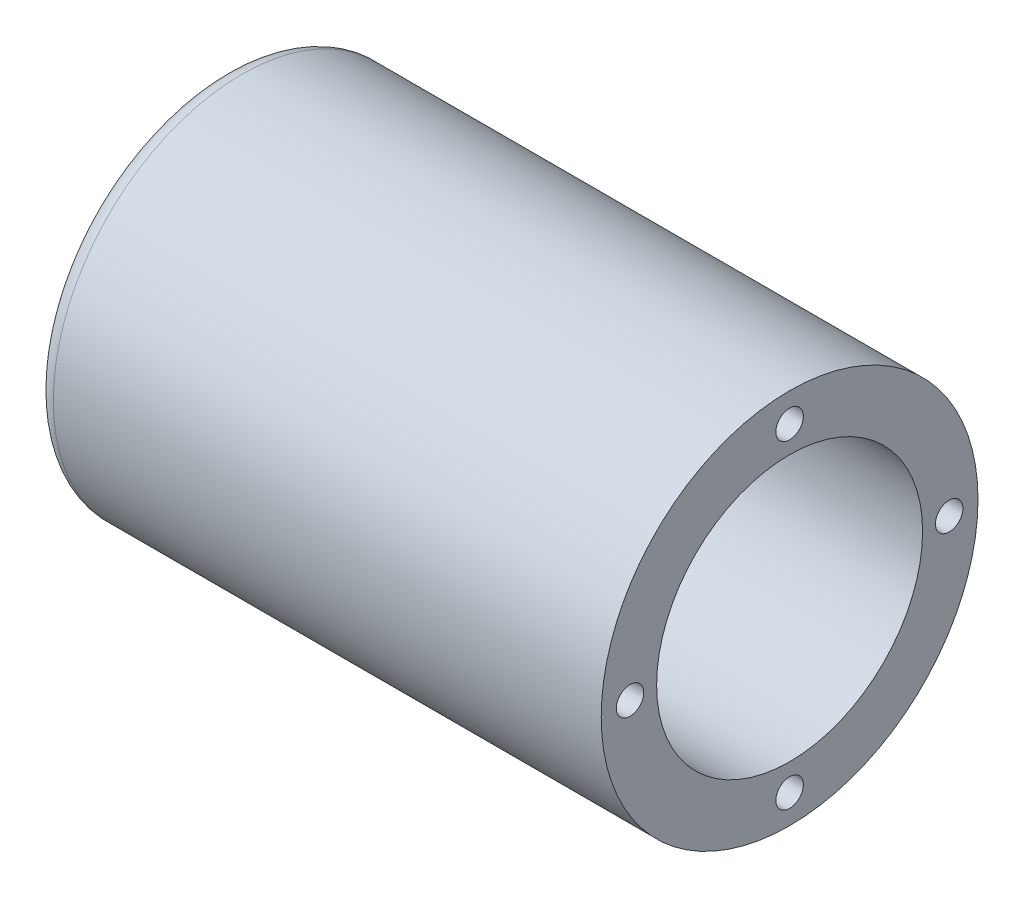
ISO-10303-21;
HEADER;
FILE_DESCRIPTION(('STEP AP214'),'2;1');
FILE_NAME('part.step','',(''),(''),'','','');
FILE_SCHEMA(('AUTOMOTIVE_DESIGN { 1 0 10303 214 1 1 1 1 }'));
ENDSEC;
DATA;
#1=APPLICATION_CONTEXT('core data for automotive mechanical design processes');
#2=APPLICATION_PROTOCOL_DEFINITION('international standard','automotive_design',2000,#1);
#3=PRODUCT_CONTEXT('',#1,'mechanical');
#4=PRODUCT('Part','Part','',(#3));
#5=PRODUCT_RELATED_PRODUCT_CATEGORY('part','',(#4));
#6=PRODUCT_DEFINITION_FORMATION('','',#4);
#7=PRODUCT_DEFINITION_CONTEXT('part definition',#1,'design');
#8=PRODUCT_DEFINITION('design','',#6,#7);
#9=PRODUCT_DEFINITION_SHAPE('','',#8);
#10=(LENGTH_UNIT() NAMED_UNIT(*) SI_UNIT(.MILLI.,.METRE.));
#11=(NAMED_UNIT(*) PLANE_ANGLE_UNIT() SI_UNIT($,.RADIAN.));
#12=(NAMED_UNIT(*) SI_UNIT($,.STERADIAN.) SOLID_ANGLE_UNIT());
#13=UNCERTAINTY_MEASURE_WITH_UNIT(LENGTH_MEASURE(1.E-05),#10,'distance_accuracy_value','');
#14=(GEOMETRIC_REPRESENTATION_CONTEXT(3) GLOBAL_UNCERTAINTY_ASSIGNED_CONTEXT((#13)) GLOBAL_UNIT_ASSIGNED_CONTEXT((#10,
#11,#12)) REPRESENTATION_CONTEXT('',''));
#15=CARTESIAN_POINT('',(0.,0.,0.));
#16=DIRECTION('',(0.,0.,1.));
#17=DIRECTION('',(1.,0.,0.));
#18=AXIS2_PLACEMENT_3D('',#15,#16,#17);
#19=CARTESIAN_POINT('',(-31.9,0.,0.));
#20=DIRECTION('',(1.,0.,0.));
#21=DIRECTION('',(0.,1.,0.));
#22=AXIS2_PLACEMENT_3D('',#19,#20,#21);
#23=PLANE('',#22);
#24=CARTESIAN_POINT('',(-31.9,0.,0.));
#25=DIRECTION('',(1.,0.,0.));
#26=DIRECTION('',(0.,1.,0.));
#27=AXIS2_PLACEMENT_3D('',#24,#25,#26);
#28=CIRCLE('',#27,19.25);
#29=CARTESIAN_POINT('',(-31.9,19.25,0.));
#30=VERTEX_POINT('',#29);
#31=EDGE_CURVE('E44',#30,#30,#28,.F.);
#32=ORIENTED_EDGE('',*,*,#31,.T.);
#33=EDGE_LOOP('',(#32));
#34=FACE_BOUND('',#33,.T.);
#35=CARTESIAN_POINT('',(-31.9,0.,12.));
#36=DIRECTION('',(1.,0.,0.));
#37=DIRECTION('',(0.,1.,0.));
#38=AXIS2_PLACEMENT_3D('',#35,#36,#37);
#39=CIRCLE('',#38,1.8);
#40=CARTESIAN_POINT('',(-31.9,1.79999999999995,12.));
#41=VERTEX_POINT('',#40);
#42=EDGE_CURVE('E90',#41,#41,#39,.F.);
#43=ORIENTED_EDGE('',*,*,#42,.F.);
#44=EDGE_LOOP('',(#43));
#45=FACE_BOUND('',#44,.T.);
#46=CARTESIAN_POINT('',(-31.9,-12.,0.));
#47=DIRECTION('',(1.,0.,0.));
#48=DIRECTION('',(0.,1.,0.));
#49=AXIS2_PLACEMENT_3D('',#46,#47,#48);
#50=CIRCLE('',#49,1.8);
#51=CARTESIAN_POINT('',(-31.9,-10.2,0.));
#52=VERTEX_POINT('',#51);
#53=EDGE_CURVE('E98',#52,#52,#50,.F.);
#54=ORIENTED_EDGE('',*,*,#53,.F.);
#55=EDGE_LOOP('',(#54));
#56=FACE_BOUND('',#55,.T.);
#57=CARTESIAN_POINT('',(-31.9,1.19833393264433E-13,-12.));
#58=DIRECTION('',(1.,0.,0.));
#59=DIRECTION('',(0.,1.,0.));
#60=AXIS2_PLACEMENT_3D('',#57,#58,#59);
#61=CIRCLE('',#60,1.8);
#62=CARTESIAN_POINT('',(-31.9,1.80000000000012,-12.));
#63=VERTEX_POINT('',#62);
#64=EDGE_CURVE('E91',#63,#63,#61,.F.);
#65=ORIENTED_EDGE('',*,*,#64,.F.);
#66=EDGE_LOOP('',(#65));
#67=FACE_BOUND('',#66,.T.);
#68=CARTESIAN_POINT('',(-31.9,12.,0.));
#69=DIRECTION('',(1.,0.,0.));
#70=DIRECTION('',(0.,1.,0.));
#71=AXIS2_PLACEMENT_3D('',#68,#69,#70);
#72=CIRCLE('',#71,1.8);
#73=CARTESIAN_POINT('',(-31.9,13.8,0.));
#74=VERTEX_POINT('',#73);
#75=EDGE_CURVE('E71',#74,#74,#72,.F.);
#76=ORIENTED_EDGE('',*,*,#75,.F.);
#77=EDGE_LOOP('',(#76));
#78=FACE_BOUND('',#77,.T.);
#79=ADVANCED_FACE('F37',(#34,#45,#56,#67,#78),#23,.F.);
#80=CARTESIAN_POINT('',(-31.9,0.,0.));
#81=DIRECTION('',(-1.,0.,0.));
#82=DIRECTION('',(0.,-1.,0.));
#83=AXIS2_PLACEMENT_3D('',#80,#81,#82);
#84=CYLINDRICAL_SURFACE('',#83,21.25);
#85=CARTESIAN_POINT('',(-29.9,0.,0.));
#86=DIRECTION('',(1.,0.,0.));
#87=DIRECTION('',(0.,1.,0.));
#88=AXIS2_PLACEMENT_3D('',#85,#86,#87);
#89=CIRCLE('',#88,21.25);
#90=CARTESIAN_POINT('',(-29.9,21.25,0.));
#91=VERTEX_POINT('',#90);
#92=EDGE_CURVE('E10',#91,#91,#89,.T.);
#93=ORIENTED_EDGE('',*,*,#92,.T.);
#94=EDGE_LOOP('',(#93));
#95=FACE_BOUND('',#94,.T.);
#96=CARTESIAN_POINT('',(31.9,0.,0.));
#97=DIRECTION('',(-1.,0.,0.));
#98=DIRECTION('',(0.,-1.,0.));
#99=AXIS2_PLACEMENT_3D('',#96,#97,#98);
#100=CIRCLE('',#99,21.25);
#101=CARTESIAN_POINT('',(31.9,-21.25,0.));
#102=VERTEX_POINT('',#101);
#103=EDGE_CURVE('E48',#102,#102,#100,.T.);
#104=ORIENTED_EDGE('',*,*,#103,.T.);
#105=EDGE_LOOP('',(#104));
#106=FACE_BOUND('',#105,.T.);
#107=ADVANCED_FACE('F134',(#95,#106),#84,.T.);
#108=CARTESIAN_POINT('',(31.9,21.25,0.));
#109=DIRECTION('',(-1.,0.,0.));
#110=DIRECTION('',(0.,-1.,0.));
#111=AXIS2_PLACEMENT_3D('',#108,#109,#110);
#112=PLANE('',#111);
#113=CARTESIAN_POINT('',(31.9,0.,-18.));
#114=DIRECTION('',(1.,0.,0.));
#115=DIRECTION('',(0.,0.,-1.));
#116=AXIS2_PLACEMENT_3D('',#113,#114,#115);
#117=CIRCLE('',#116,1.55);
#118=CARTESIAN_POINT('',(31.9,1.54999999999994,-18.));
#119=VERTEX_POINT('',#118);
#120=EDGE_CURVE('E80',#119,#119,#117,.T.);
#121=ORIENTED_EDGE('',*,*,#120,.F.);
#122=EDGE_LOOP('',(#121));
#123=FACE_BOUND('',#122,.T.);
#124=CARTESIAN_POINT('',(31.9,-18.,0.));
#125=DIRECTION('',(1.,0.,0.));
#126=DIRECTION('',(0.,-1.,0.));
#127=AXIS2_PLACEMENT_3D('',#124,#125,#126);
#128=CIRCLE('',#127,1.55);
#129=CARTESIAN_POINT('',(31.9,-16.45,0.));
#130=VERTEX_POINT('',#129);
#131=EDGE_CURVE('E74',#130,#130,#128,.T.);
#132=ORIENTED_EDGE('',*,*,#131,.F.);
#133=EDGE_LOOP('',(#132));
#134=FACE_BOUND('',#133,.T.);
#135=CARTESIAN_POINT('',(31.9,1.94399927231449E-13,18.));
#136=DIRECTION('',(1.,0.,0.));
#137=DIRECTION('',(0.,0.,1.));
#138=AXIS2_PLACEMENT_3D('',#135,#136,#137);
#139=CIRCLE('',#138,1.55);
#140=CARTESIAN_POINT('',(31.9,1.55000000000019,18.));
#141=VERTEX_POINT('',#140);
#142=EDGE_CURVE('E67',#141,#141,#139,.T.);
#143=ORIENTED_EDGE('',*,*,#142,.F.);
#144=EDGE_LOOP('',(#143));
#145=FACE_BOUND('',#144,.T.);
#146=CARTESIAN_POINT('',(31.9,18.,0.));
#147=DIRECTION('',(1.,0.,0.));
#148=DIRECTION('',(0.,1.,0.));
#149=AXIS2_PLACEMENT_3D('',#146,#147,#148);
#150=CIRCLE('',#149,1.55);
#151=CARTESIAN_POINT('',(31.9,19.55,0.));
#152=VERTEX_POINT('',#151);
#153=EDGE_CURVE('E61',#152,#152,#150,.T.);
#154=ORIENTED_EDGE('',*,*,#153,.F.);
#155=EDGE_LOOP('',(#154));
#156=FACE_BOUND('',#155,.T.);
#157=CARTESIAN_POINT('',(31.9,0.,0.));
#158=DIRECTION('',(1.,0.,0.));
#159=DIRECTION('',(0.,1.,0.));
#160=AXIS2_PLACEMENT_3D('',#157,#158,#159);
#161=CIRCLE('',#160,15.);
#162=CARTESIAN_POINT('',(31.9,15.,0.));
#163=VERTEX_POINT('',#162);
#164=EDGE_CURVE('E55',#163,#163,#161,.T.);
#165=ORIENTED_EDGE('',*,*,#164,.F.);
#166=EDGE_LOOP('',(#165));
#167=FACE_BOUND('',#166,.T.);
#168=ORIENTED_EDGE('',*,*,#103,.F.);
#169=EDGE_LOOP('',(#168));
#170=FACE_BOUND('',#169,.T.);
#171=ADVANCED_FACE('F128',(#123,#134,#145,#156,#167,#170),#112,.F.);
#172=CARTESIAN_POINT('',(-29.4,0.,0.));
#173=DIRECTION('',(1.,0.,0.));
#174=DIRECTION('',(0.,1.,0.));
#175=AXIS2_PLACEMENT_3D('',#172,#173,#174);
#176=CYLINDRICAL_SURFACE('',#175,15.);
#177=CARTESIAN_POINT('',(-29.4,0.,0.));
#178=DIRECTION('',(1.,0.,0.));
#179=DIRECTION('',(0.,1.,0.));
#180=AXIS2_PLACEMENT_3D('',#177,#178,#179);
#181=CIRCLE('',#180,15.);
#182=CARTESIAN_POINT('',(-29.4,15.,0.));
#183=VERTEX_POINT('',#182);
#184=EDGE_CURVE('E52',#183,#183,#181,.T.);
#185=ORIENTED_EDGE('',*,*,#184,.F.);
#186=EDGE_LOOP('',(#185));
#187=FACE_BOUND('',#186,.T.);
#188=ORIENTED_EDGE('',*,*,#164,.T.);
#189=EDGE_LOOP('',(#188));
#190=FACE_BOUND('',#189,.T.);
#191=ADVANCED_FACE('F116',(#187,#190),#176,.F.);
#192=CARTESIAN_POINT('',(-29.4,0.,0.));
#193=DIRECTION('',(1.,0.,0.));
#194=DIRECTION('',(0.,1.,0.));
#195=AXIS2_PLACEMENT_3D('',#192,#193,#194);
#196=PLANE('',#195);
#197=CARTESIAN_POINT('',(-29.4,0.,12.));
#198=DIRECTION('',(1.,0.,0.));
#199=DIRECTION('',(0.,0.,1.));
#200=AXIS2_PLACEMENT_3D('',#197,#198,#199);
#201=CIRCLE('',#200,1.8);
#202=CARTESIAN_POINT('',(-29.4,0.,13.8));
#203=VERTEX_POINT('',#202);
#204=EDGE_CURVE('E101',#203,#203,#201,.T.);
#205=ORIENTED_EDGE('',*,*,#204,.F.);
#206=EDGE_LOOP('',(#205));
#207=FACE_BOUND('',#206,.T.);
#208=CARTESIAN_POINT('',(-29.4,-12.,0.));
#209=DIRECTION('',(1.,0.,0.));
#210=DIRECTION('',(0.,-1.,0.));
#211=AXIS2_PLACEMENT_3D('',#208,#209,#210);
#212=CIRCLE('',#211,1.8);
#213=CARTESIAN_POINT('',(-29.4,-13.8,0.));
#214=VERTEX_POINT('',#213);
#215=EDGE_CURVE('E94',#214,#214,#212,.T.);
#216=ORIENTED_EDGE('',*,*,#215,.F.);
#217=EDGE_LOOP('',(#216));
#218=FACE_BOUND('',#217,.T.);
#219=CARTESIAN_POINT('',(-29.4,1.20292635814113E-13,-12.));
#220=DIRECTION('',(1.,0.,0.));
#221=DIRECTION('',(0.,0.,-1.));
#222=AXIS2_PLACEMENT_3D('',#219,#220,#221);
#223=CIRCLE('',#222,1.8);
#224=CARTESIAN_POINT('',(-29.4,1.39146635043866E-13,-13.8));
#225=VERTEX_POINT('',#224);
#226=EDGE_CURVE('E95',#225,#225,#223,.T.);
#227=ORIENTED_EDGE('',*,*,#226,.F.);
#228=EDGE_LOOP('',(#227));
#229=FACE_BOUND('',#228,.T.);
#230=CARTESIAN_POINT('',(-29.4,12.,0.));
#231=DIRECTION('',(1.,0.,0.));
#232=DIRECTION('',(0.,1.,0.));
#233=AXIS2_PLACEMENT_3D('',#230,#231,#232);
#234=CIRCLE('',#233,1.8);
#235=CARTESIAN_POINT('',(-29.4,13.8,0.));
#236=VERTEX_POINT('',#235);
#237=EDGE_CURVE('E87',#236,#236,#234,.T.);
#238=ORIENTED_EDGE('',*,*,#237,.F.);
#239=EDGE_LOOP('',(#238));
#240=FACE_BOUND('',#239,.T.);
#241=ORIENTED_EDGE('',*,*,#184,.T.);
#242=EDGE_LOOP('',(#241));
#243=FACE_BOUND('',#242,.T.);
#244=ADVANCED_FACE('F112',(#207,#218,#229,#240,#243),#196,.T.);
#245=CARTESIAN_POINT('',(28.1,18.,0.));
#246=DIRECTION('',(1.,0.,0.));
#247=DIRECTION('',(0.,1.,0.));
#248=AXIS2_PLACEMENT_3D('',#245,#246,#247);
#249=CYLINDRICAL_SURFACE('',#248,1.55);
#250=CARTESIAN_POINT('',(28.1,18.,0.));
#251=DIRECTION('',(1.,0.,0.));
#252=DIRECTION('',(0.,1.,0.));
#253=AXIS2_PLACEMENT_3D('',#250,#251,#252);
#254=CIRCLE('',#253,1.55);
#255=CARTESIAN_POINT('',(28.1,19.55,0.));
#256=VERTEX_POINT('',#255);
#257=EDGE_CURVE('E58',#256,#256,#254,.T.);
#258=CARTESIAN_POINT('',(28.1,19.55,0.));
#259=CARTESIAN_POINT('',(28.1395833333333,19.55,0.));
#260=CARTESIAN_POINT('',(28.1791666666667,19.55,0.));
#261=CARTESIAN_POINT('',(28.2583333333333,19.55,0.));
#262=CARTESIAN_POINT('',(28.2979166666667,19.55,0.));
#263=CARTESIAN_POINT('',(28.3770833333333,19.55,0.));
#264=CARTESIAN_POINT('',(28.4166666666667,19.55,0.));
#265=CARTESIAN_POINT('',(28.4958333333333,19.55,0.));
#266=CARTESIAN_POINT('',(28.5354166666667,19.55,0.));
#267=CARTESIAN_POINT('',(28.6145833333333,19.55,0.));
#268=CARTESIAN_POINT('',(28.6541666666667,19.55,0.));
#269=CARTESIAN_POINT('',(28.7333333333333,19.55,0.));
#270=CARTESIAN_POINT('',(28.7729166666667,19.55,0.));
#271=CARTESIAN_POINT('',(28.8520833333333,19.55,0.));
#272=CARTESIAN_POINT('',(28.8916666666667,19.55,0.));
#273=CARTESIAN_POINT('',(28.9708333333333,19.55,0.));
#274=CARTESIAN_POINT('',(29.0104166666667,19.55,0.));
#275=CARTESIAN_POINT('',(29.0895833333333,19.55,0.));
#276=CARTESIAN_POINT('',(29.1291666666667,19.55,0.));
#277=CARTESIAN_POINT('',(29.2083333333333,19.55,0.));
#278=CARTESIAN_POINT('',(29.2479166666667,19.55,0.));
#279=CARTESIAN_POINT('',(29.3270833333333,19.55,0.));
#280=CARTESIAN_POINT('',(29.3666666666667,19.55,0.));
#281=CARTESIAN_POINT('',(29.4458333333333,19.55,0.));
#282=CARTESIAN_POINT('',(29.4854166666667,19.55,0.));
#283=CARTESIAN_POINT('',(29.5645833333333,19.55,0.));
#284=CARTESIAN_POINT('',(29.6041666666667,19.55,0.));
#285=CARTESIAN_POINT('',(29.6833333333333,19.55,0.));
#286=CARTESIAN_POINT('',(29.7229166666667,19.55,0.));
#287=CARTESIAN_POINT('',(29.8020833333333,19.55,0.));
#288=CARTESIAN_POINT('',(29.8416666666667,19.55,0.));
#289=CARTESIAN_POINT('',(29.9208333333333,19.55,0.));
#290=CARTESIAN_POINT('',(29.9604166666667,19.55,0.));
#291=CARTESIAN_POINT('',(30.0395833333333,19.55,0.));
#292=CARTESIAN_POINT('',(30.0791666666667,19.55,0.));
#293=CARTESIAN_POINT('',(30.1583333333333,19.55,0.));
#294=CARTESIAN_POINT('',(30.1979166666667,19.55,0.));
#295=CARTESIAN_POINT('',(30.2770833333333,19.55,0.));
#296=CARTESIAN_POINT('',(30.3166666666667,19.55,0.));
#297=CARTESIAN_POINT('',(30.3958333333333,19.55,0.));
#298=CARTESIAN_POINT('',(30.4354166666667,19.55,0.));
#299=CARTESIAN_POINT('',(30.5145833333333,19.55,0.));
#300=CARTESIAN_POINT('',(30.5541666666667,19.55,0.));
#301=CARTESIAN_POINT('',(30.6333333333333,19.55,0.));
#302=CARTESIAN_POINT('',(30.6729166666667,19.55,0.));
#303=CARTESIAN_POINT('',(30.7520833333333,19.55,0.));
#304=CARTESIAN_POINT('',(30.7916666666667,19.55,0.));
#305=CARTESIAN_POINT('',(30.8708333333333,19.55,0.));
#306=CARTESIAN_POINT('',(30.9104166666667,19.55,0.));
#307=CARTESIAN_POINT('',(30.9895833333333,19.55,0.));
#308=CARTESIAN_POINT('',(31.0291666666667,19.55,0.));
#309=CARTESIAN_POINT('',(31.1083333333333,19.55,0.));
#310=CARTESIAN_POINT('',(31.1479166666667,19.55,0.));
#311=CARTESIAN_POINT('',(31.2270833333333,19.55,0.));
#312=CARTESIAN_POINT('',(31.2666666666667,19.55,0.));
#313=CARTESIAN_POINT('',(31.3458333333333,19.55,0.));
#314=CARTESIAN_POINT('',(31.3854166666667,19.55,0.));
#315=CARTESIAN_POINT('',(31.4645833333333,19.55,0.));
#316=CARTESIAN_POINT('',(31.5041666666667,19.55,0.));
#317=CARTESIAN_POINT('',(31.5833333333333,19.55,0.));
#318=CARTESIAN_POINT('',(31.6229166666667,19.55,0.));
#319=CARTESIAN_POINT('',(31.7020833333333,19.55,0.));
#320=CARTESIAN_POINT('',(31.7416666666667,19.55,0.));
#321=CARTESIAN_POINT('',(31.8208333333333,19.55,0.));
#322=CARTESIAN_POINT('',(31.8604166666667,19.55,0.));
#323=CARTESIAN_POINT('',(31.9,19.55,0.));
#324=B_SPLINE_CURVE_WITH_KNOTS('',3,(#258,#259,#260,#261,#262,#263,#264,#265,#266,#267,#268,
#269,#270,#271,#272,#273,#274,#275,#276,#277,#278,#279,#280,#281,#282,#283,#284,#285,#286,#287,
#288,#289,#290,#291,#292,#293,#294,#295,#296,#297,#298,#299,#300,#301,#302,#303,#304,#305,#306,
#307,#308,#309,#310,#311,#312,#313,#314,#315,#316,#317,#318,#319,#320,#321,#322,#323),
.UNSPECIFIED.,.F.,.F.,(4,2,2,2,2,2,2,2,2,2,2,2,2,2,2,2,2,2,2,2,2,2,2,2,2,2,2,2,2,2,2,2,4),(0.,
0.118750000000001,0.237500000000002,0.356250000000002,0.475000000000003,0.593750000000001,
0.712500000000001,0.831250000000002,0.950000000000003,1.06875,1.1875,1.30625,1.425,1.54375,
1.6625,1.78125,1.9,2.01875,2.1375,2.25625,2.375,2.49375,2.6125,2.73125,2.85,2.96875,3.0875,
3.20625,3.325,3.44375,3.5625,3.68125,3.8),.UNSPECIFIED.);
#325=EDGE_CURVE('BSEAM115',#256,#152,#324,.T.);
#326=ORIENTED_EDGE('',*,*,#257,.F.);
#327=ORIENTED_EDGE('',*,*,#153,.T.);
#328=ORIENTED_EDGE('',*,*,#325,.T.);
#329=ORIENTED_EDGE('',*,*,#325,.F.);
#330=EDGE_LOOP('',(#326,#328,#327,#329));
#331=FACE_BOUND('',#330,.T.);
#332=ADVANCED_FACE('F115',(#331),#249,.F.);
#333=CARTESIAN_POINT('',(28.1,18.,0.));
#334=DIRECTION('',(1.,0.,0.));
#335=DIRECTION('',(0.,1.,0.));
#336=AXIS2_PLACEMENT_3D('',#333,#334,#335);
#337=PLANE('',#336);
#338=ORIENTED_EDGE('',*,*,#257,.T.);
#339=EDGE_LOOP('',(#338));
#340=FACE_BOUND('',#339,.T.);
#341=ADVANCED_FACE('F148',(#340),#337,.T.);
#342=CARTESIAN_POINT('',(28.1,1.93701878555935E-13,18.));
#343=DIRECTION('',(1.,0.,0.));
#344=DIRECTION('',(0.,1.,0.));
#345=AXIS2_PLACEMENT_3D('',#342,#343,#344);
#346=CYLINDRICAL_SURFACE('',#345,1.55);
#347=CARTESIAN_POINT('',(28.1,1.93701878555935E-13,18.));
#348=DIRECTION('',(1.,0.,0.));
#349=DIRECTION('',(0.,0.,1.));
#350=AXIS2_PLACEMENT_3D('',#347,#348,#349);
#351=CIRCLE('',#350,1.55);
#352=CARTESIAN_POINT('',(28.1,1.55000000000019,18.));
#353=VERTEX_POINT('',#352);
#354=EDGE_CURVE('E70',#353,#353,#351,.T.);
#355=CARTESIAN_POINT('',(28.1,1.55000000000019,18.));
#356=CARTESIAN_POINT('',(28.1395833333333,1.55000000000019,18.));
#357=CARTESIAN_POINT('',(28.1791666666667,1.55000000000019,18.));
#358=CARTESIAN_POINT('',(28.2583333333333,1.55000000000019,18.));
#359=CARTESIAN_POINT('',(28.2979166666667,1.55000000000019,18.));
#360=CARTESIAN_POINT('',(28.3770833333333,1.55000000000019,18.));
#361=CARTESIAN_POINT('',(28.4166666666667,1.55000000000019,18.));
#362=CARTESIAN_POINT('',(28.4958333333333,1.55000000000019,18.));
#363=CARTESIAN_POINT('',(28.5354166666667,1.55000000000019,18.));
#364=CARTESIAN_POINT('',(28.6145833333333,1.55000000000019,18.));
#365=CARTESIAN_POINT('',(28.6541666666667,1.55000000000019,18.));
#366=CARTESIAN_POINT('',(28.7333333333333,1.55000000000019,18.));
#367=CARTESIAN_POINT('',(28.7729166666667,1.55000000000019,18.));
#368=CARTESIAN_POINT('',(28.8520833333333,1.55000000000019,18.));
#369=CARTESIAN_POINT('',(28.8916666666667,1.55000000000019,18.));
#370=CARTESIAN_POINT('',(28.9708333333333,1.55000000000019,18.));
#371=CARTESIAN_POINT('',(29.0104166666667,1.55000000000019,18.));
#372=CARTESIAN_POINT('',(29.0895833333333,1.55000000000019,18.));
#373=CARTESIAN_POINT('',(29.1291666666667,1.55000000000019,18.));
#374=CARTESIAN_POINT('',(29.2083333333333,1.55000000000019,18.));
#375=CARTESIAN_POINT('',(29.2479166666667,1.55000000000019,18.));
#376=CARTESIAN_POINT('',(29.3270833333333,1.55000000000019,18.));
#377=CARTESIAN_POINT('',(29.3666666666667,1.55000000000019,18.));
#378=CARTESIAN_POINT('',(29.4458333333333,1.55000000000019,18.));
#379=CARTESIAN_POINT('',(29.4854166666667,1.55000000000019,18.));
#380=CARTESIAN_POINT('',(29.5645833333333,1.55000000000019,18.));
#381=CARTESIAN_POINT('',(29.6041666666667,1.55000000000019,18.));
#382=CARTESIAN_POINT('',(29.6833333333333,1.55000000000019,18.));
#383=CARTESIAN_POINT('',(29.7229166666667,1.55000000000019,18.));
#384=CARTESIAN_POINT('',(29.8020833333333,1.55000000000019,18.));
#385=CARTESIAN_POINT('',(29.8416666666667,1.55000000000019,18.));
#386=CARTESIAN_POINT('',(29.9208333333333,1.55000000000019,18.));
#387=CARTESIAN_POINT('',(29.9604166666667,1.55000000000019,18.));
#388=CARTESIAN_POINT('',(30.0395833333333,1.55000000000019,18.));
#389=CARTESIAN_POINT('',(30.0791666666667,1.55000000000019,18.));
#390=CARTESIAN_POINT('',(30.1583333333333,1.55000000000019,18.));
#391=CARTESIAN_POINT('',(30.1979166666667,1.55000000000019,18.));
#392=CARTESIAN_POINT('',(30.2770833333333,1.55000000000019,18.));
#393=CARTESIAN_POINT('',(30.3166666666667,1.55000000000019,18.));
#394=CARTESIAN_POINT('',(30.3958333333333,1.55000000000019,18.));
#395=CARTESIAN_POINT('',(30.4354166666667,1.55000000000019,18.));
#396=CARTESIAN_POINT('',(30.5145833333333,1.55000000000019,18.));
#397=CARTESIAN_POINT('',(30.5541666666667,1.55000000000019,18.));
#398=CARTESIAN_POINT('',(30.6333333333333,1.55000000000019,18.));
#399=CARTESIAN_POINT('',(30.6729166666667,1.55000000000019,18.));
#400=CARTESIAN_POINT('',(30.7520833333333,1.55000000000019,18.));
#401=CARTESIAN_POINT('',(30.7916666666667,1.55000000000019,18.));
#402=CARTESIAN_POINT('',(30.8708333333333,1.55000000000019,18.));
#403=CARTESIAN_POINT('',(30.9104166666667,1.55000000000019,18.));
#404=CARTESIAN_POINT('',(30.9895833333333,1.55000000000019,18.));
#405=CARTESIAN_POINT('',(31.0291666666667,1.55000000000019,18.));
#406=CARTESIAN_POINT('',(31.1083333333333,1.55000000000019,18.));
#407=CARTESIAN_POINT('',(31.1479166666667,1.55000000000019,18.));
#408=CARTESIAN_POINT('',(31.2270833333333,1.55000000000019,18.));
#409=CARTESIAN_POINT('',(31.2666666666667,1.55000000000019,18.));
#410=CARTESIAN_POINT('',(31.3458333333333,1.55000000000019,18.));
#411=CARTESIAN_POINT('',(31.3854166666667,1.55000000000019,18.));
#412=CARTESIAN_POINT('',(31.4645833333333,1.55000000000019,18.));
#413=CARTESIAN_POINT('',(31.5041666666667,1.55000000000019,18.));
#414=CARTESIAN_POINT('',(31.5833333333333,1.55000000000019,18.));
#415=CARTESIAN_POINT('',(31.6229166666667,1.55000000000019,18.));
#416=CARTESIAN_POINT('',(31.7020833333333,1.55000000000019,18.));
#417=CARTESIAN_POINT('',(31.7416666666667,1.55000000000019,18.));
#418=CARTESIAN_POINT('',(31.8208333333333,1.55000000000019,18.));
#419=CARTESIAN_POINT('',(31.8604166666667,1.55000000000019,18.));
#420=CARTESIAN_POINT('',(31.9,1.55000000000019,18.));
#421=B_SPLINE_CURVE_WITH_KNOTS('',3,(#355,#356,#357,#358,#359,#360,#361,#362,#363,#364,#365,
#366,#367,#368,#369,#370,#371,#372,#373,#374,#375,#376,#377,#378,#379,#380,#381,#382,#383,#384,
#385,#386,#387,#388,#389,#390,#391,#392,#393,#394,#395,#396,#397,#398,#399,#400,#401,#402,#403,
#404,#405,#406,#407,#408,#409,#410,#411,#412,#413,#414,#415,#416,#417,#418,#419,#420),
.UNSPECIFIED.,.F.,.F.,(4,2,2,2,2,2,2,2,2,2,2,2,2,2,2,2,2,2,2,2,2,2,2,2,2,2,2,2,2,2,2,2,4),(0.,
0.118750000000001,0.237500000000002,0.356250000000002,0.475000000000003,0.593750000000001,
0.712500000000001,0.831250000000002,0.950000000000003,1.06875,1.1875,1.30625,1.425,1.54375,
1.6625,1.78125,1.9,2.01875,2.1375,2.25625,2.375,2.49375,2.6125,2.73125,2.85,2.96875,3.0875,
3.20625,3.325,3.44375,3.5625,3.68125,3.8),.UNSPECIFIED.);
#422=EDGE_CURVE('BSEAM152',#353,#141,#421,.T.);
#423=ORIENTED_EDGE('',*,*,#354,.F.);
#424=ORIENTED_EDGE('',*,*,#142,.T.);
#425=ORIENTED_EDGE('',*,*,#422,.T.);
#426=ORIENTED_EDGE('',*,*,#422,.F.);
#427=EDGE_LOOP('',(#423,#425,#424,#426));
#428=FACE_BOUND('',#427,.T.);
#429=ADVANCED_FACE('F152',(#428),#346,.F.);
#430=CARTESIAN_POINT('',(28.1,1.93701878555935E-13,18.));
#431=DIRECTION('',(1.,0.,0.));
#432=DIRECTION('',(0.,0.,1.));
#433=AXIS2_PLACEMENT_3D('',#430,#431,#432);
#434=PLANE('',#433);
#435=ORIENTED_EDGE('',*,*,#354,.T.);
#436=EDGE_LOOP('',(#435));
#437=FACE_BOUND('',#436,.T.);
#438=ADVANCED_FACE('F156',(#437),#434,.T.);
#439=CARTESIAN_POINT('',(28.1,-18.,0.));
#440=DIRECTION('',(1.,0.,0.));
#441=DIRECTION('',(0.,1.,0.));
#442=AXIS2_PLACEMENT_3D('',#439,#440,#441);
#443=CYLINDRICAL_SURFACE('',#442,1.55);
#444=CARTESIAN_POINT('',(28.1,-18.,0.));
#445=DIRECTION('',(1.,0.,0.));
#446=DIRECTION('',(0.,-1.,0.));
#447=AXIS2_PLACEMENT_3D('',#444,#445,#446);
#448=CIRCLE('',#447,1.55);
#449=CARTESIAN_POINT('',(28.1,-16.45,0.));
#450=VERTEX_POINT('',#449);
#451=EDGE_CURVE('E77',#450,#450,#448,.T.);
#452=CARTESIAN_POINT('',(28.1,-16.45,0.));
#453=CARTESIAN_POINT('',(28.1395833333333,-16.45,0.));
#454=CARTESIAN_POINT('',(28.1791666666667,-16.45,0.));
#455=CARTESIAN_POINT('',(28.2583333333333,-16.45,0.));
#456=CARTESIAN_POINT('',(28.2979166666667,-16.45,0.));
#457=CARTESIAN_POINT('',(28.3770833333333,-16.45,0.));
#458=CARTESIAN_POINT('',(28.4166666666667,-16.45,0.));
#459=CARTESIAN_POINT('',(28.4958333333333,-16.45,0.));
#460=CARTESIAN_POINT('',(28.5354166666667,-16.45,0.));
#461=CARTESIAN_POINT('',(28.6145833333333,-16.45,0.));
#462=CARTESIAN_POINT('',(28.6541666666667,-16.45,0.));
#463=CARTESIAN_POINT('',(28.7333333333333,-16.45,0.));
#464=CARTESIAN_POINT('',(28.7729166666667,-16.45,0.));
#465=CARTESIAN_POINT('',(28.8520833333333,-16.45,0.));
#466=CARTESIAN_POINT('',(28.8916666666667,-16.45,0.));
#467=CARTESIAN_POINT('',(28.9708333333333,-16.45,0.));
#468=CARTESIAN_POINT('',(29.0104166666667,-16.45,0.));
#469=CARTESIAN_POINT('',(29.0895833333333,-16.45,0.));
#470=CARTESIAN_POINT('',(29.1291666666667,-16.45,0.));
#471=CARTESIAN_POINT('',(29.2083333333333,-16.45,0.));
#472=CARTESIAN_POINT('',(29.2479166666667,-16.45,0.));
#473=CARTESIAN_POINT('',(29.3270833333333,-16.45,0.));
#474=CARTESIAN_POINT('',(29.3666666666667,-16.45,0.));
#475=CARTESIAN_POINT('',(29.4458333333333,-16.45,0.));
#476=CARTESIAN_POINT('',(29.4854166666667,-16.45,0.));
#477=CARTESIAN_POINT('',(29.5645833333333,-16.45,0.));
#478=CARTESIAN_POINT('',(29.6041666666667,-16.45,0.));
#479=CARTESIAN_POINT('',(29.6833333333333,-16.45,0.));
#480=CARTESIAN_POINT('',(29.7229166666667,-16.45,0.));
#481=CARTESIAN_POINT('',(29.8020833333333,-16.45,0.));
#482=CARTESIAN_POINT('',(29.8416666666667,-16.45,0.));
#483=CARTESIAN_POINT('',(29.9208333333333,-16.45,0.));
#484=CARTESIAN_POINT('',(29.9604166666667,-16.45,0.));
#485=CARTESIAN_POINT('',(30.0395833333333,-16.45,0.));
#486=CARTESIAN_POINT('',(30.0791666666667,-16.45,0.));
#487=CARTESIAN_POINT('',(30.1583333333333,-16.45,0.));
#488=CARTESIAN_POINT('',(30.1979166666667,-16.45,0.));
#489=CARTESIAN_POINT('',(30.2770833333333,-16.45,0.));
#490=CARTESIAN_POINT('',(30.3166666666667,-16.45,0.));
#491=CARTESIAN_POINT('',(30.3958333333333,-16.45,0.));
#492=CARTESIAN_POINT('',(30.4354166666667,-16.45,0.));
#493=CARTESIAN_POINT('',(30.5145833333333,-16.45,0.));
#494=CARTESIAN_POINT('',(30.5541666666667,-16.45,0.));
#495=CARTESIAN_POINT('',(30.6333333333333,-16.45,0.));
#496=CARTESIAN_POINT('',(30.6729166666667,-16.45,0.));
#497=CARTESIAN_POINT('',(30.7520833333333,-16.45,0.));
#498=CARTESIAN_POINT('',(30.7916666666667,-16.45,0.));
#499=CARTESIAN_POINT('',(30.8708333333333,-16.45,0.));
#500=CARTESIAN_POINT('',(30.9104166666667,-16.45,0.));
#501=CARTESIAN_POINT('',(30.9895833333333,-16.45,0.));
#502=CARTESIAN_POINT('',(31.0291666666667,-16.45,0.));
#503=CARTESIAN_POINT('',(31.1083333333333,-16.45,0.));
#504=CARTESIAN_POINT('',(31.1479166666667,-16.45,0.));
#505=CARTESIAN_POINT('',(31.2270833333333,-16.45,0.));
#506=CARTESIAN_POINT('',(31.2666666666667,-16.45,0.));
#507=CARTESIAN_POINT('',(31.3458333333333,-16.45,0.));
#508=CARTESIAN_POINT('',(31.3854166666667,-16.45,0.));
#509=CARTESIAN_POINT('',(31.4645833333333,-16.45,0.));
#510=CARTESIAN_POINT('',(31.5041666666667,-16.45,0.));
#511=CARTESIAN_POINT('',(31.5833333333333,-16.45,0.));
#512=CARTESIAN_POINT('',(31.6229166666667,-16.45,0.));
#513=CARTESIAN_POINT('',(31.7020833333333,-16.45,0.));
#514=CARTESIAN_POINT('',(31.7416666666667,-16.45,0.));
#515=CARTESIAN_POINT('',(31.8208333333333,-16.45,0.));
#516=CARTESIAN_POINT('',(31.8604166666667,-16.45,0.));
#517=CARTESIAN_POINT('',(31.9,-16.45,0.));
#518=B_SPLINE_CURVE_WITH_KNOTS('',3,(#452,#453,#454,#455,#456,#457,#458,#459,#460,#461,#462,
#463,#464,#465,#466,#467,#468,#469,#470,#471,#472,#473,#474,#475,#476,#477,#478,#479,#480,#481,
#482,#483,#484,#485,#486,#487,#488,#489,#490,#491,#492,#493,#494,#495,#496,#497,#498,#499,#500,
#501,#502,#503,#504,#505,#506,#507,#508,#509,#510,#511,#512,#513,#514,#515,#516,#517),
.UNSPECIFIED.,.F.,.F.,(4,2,2,2,2,2,2,2,2,2,2,2,2,2,2,2,2,2,2,2,2,2,2,2,2,2,2,2,2,2,2,2,4),(0.,
0.118750000000001,0.237500000000002,0.356250000000002,0.475000000000003,0.593750000000001,
0.712500000000001,0.831250000000002,0.950000000000003,1.06875,1.1875,1.30625,1.425,1.54375,
1.6625,1.78125,1.9,2.01875,2.1375,2.25625,2.375,2.49375,2.6125,2.73125,2.85,2.96875,3.0875,
3.20625,3.325,3.44375,3.5625,3.68125,3.8),.UNSPECIFIED.);
#519=EDGE_CURVE('BSEAM160',#450,#130,#518,.T.);
#520=ORIENTED_EDGE('',*,*,#451,.F.);
#521=ORIENTED_EDGE('',*,*,#131,.T.);
#522=ORIENTED_EDGE('',*,*,#519,.T.);
#523=ORIENTED_EDGE('',*,*,#519,.F.);
#524=EDGE_LOOP('',(#520,#522,#521,#523));
#525=FACE_BOUND('',#524,.T.);
#526=ADVANCED_FACE('F160',(#525),#443,.F.);
#527=CARTESIAN_POINT('',(28.1,-18.,0.));
#528=DIRECTION('',(1.,0.,0.));
#529=DIRECTION('',(0.,-1.,0.));
#530=AXIS2_PLACEMENT_3D('',#527,#528,#529);
#531=PLANE('',#530);
#532=ORIENTED_EDGE('',*,*,#451,.T.);
#533=EDGE_LOOP('',(#532));
#534=FACE_BOUND('',#533,.T.);
#535=ADVANCED_FACE('F164',(#534),#531,.T.);
#536=CARTESIAN_POINT('',(28.1,0.,-18.));
#537=DIRECTION('',(1.,0.,0.));
#538=DIRECTION('',(0.,1.,0.));
#539=AXIS2_PLACEMENT_3D('',#536,#537,#538);
#540=CYLINDRICAL_SURFACE('',#539,1.55);
#541=CARTESIAN_POINT('',(28.1,0.,-18.));
#542=DIRECTION('',(1.,0.,0.));
#543=DIRECTION('',(0.,0.,-1.));
#544=AXIS2_PLACEMENT_3D('',#541,#542,#543);
#545=CIRCLE('',#544,1.55);
#546=CARTESIAN_POINT('',(28.1,1.54999999999994,-18.));
#547=VERTEX_POINT('',#546);
#548=EDGE_CURVE('E64',#547,#547,#545,.T.);
#549=CARTESIAN_POINT('',(28.1,1.54999999999994,-18.));
#550=CARTESIAN_POINT('',(28.1395833333333,1.54999999999994,-18.));
#551=CARTESIAN_POINT('',(28.1791666666667,1.54999999999994,-18.));
#552=CARTESIAN_POINT('',(28.2583333333333,1.54999999999994,-18.));
#553=CARTESIAN_POINT('',(28.2979166666667,1.54999999999994,-18.));
#554=CARTESIAN_POINT('',(28.3770833333333,1.54999999999994,-18.));
#555=CARTESIAN_POINT('',(28.4166666666667,1.54999999999994,-18.));
#556=CARTESIAN_POINT('',(28.4958333333333,1.54999999999994,-18.));
#557=CARTESIAN_POINT('',(28.5354166666667,1.54999999999994,-18.));
#558=CARTESIAN_POINT('',(28.6145833333333,1.54999999999994,-18.));
#559=CARTESIAN_POINT('',(28.6541666666667,1.54999999999994,-18.));
#560=CARTESIAN_POINT('',(28.7333333333333,1.54999999999994,-18.));
#561=CARTESIAN_POINT('',(28.7729166666667,1.54999999999994,-18.));
#562=CARTESIAN_POINT('',(28.8520833333333,1.54999999999994,-18.));
#563=CARTESIAN_POINT('',(28.8916666666667,1.54999999999994,-18.));
#564=CARTESIAN_POINT('',(28.9708333333333,1.54999999999994,-18.));
#565=CARTESIAN_POINT('',(29.0104166666667,1.54999999999994,-18.));
#566=CARTESIAN_POINT('',(29.0895833333333,1.54999999999994,-18.));
#567=CARTESIAN_POINT('',(29.1291666666667,1.54999999999994,-18.));
#568=CARTESIAN_POINT('',(29.2083333333333,1.54999999999994,-18.));
#569=CARTESIAN_POINT('',(29.2479166666667,1.54999999999994,-18.));
#570=CARTESIAN_POINT('',(29.3270833333333,1.54999999999994,-18.));
#571=CARTESIAN_POINT('',(29.3666666666667,1.54999999999994,-18.));
#572=CARTESIAN_POINT('',(29.4458333333333,1.54999999999994,-18.));
#573=CARTESIAN_POINT('',(29.4854166666667,1.54999999999994,-18.));
#574=CARTESIAN_POINT('',(29.5645833333333,1.54999999999994,-18.));
#575=CARTESIAN_POINT('',(29.6041666666667,1.54999999999994,-18.));
#576=CARTESIAN_POINT('',(29.6833333333333,1.54999999999994,-18.));
#577=CARTESIAN_POINT('',(29.7229166666667,1.54999999999994,-18.));
#578=CARTESIAN_POINT('',(29.8020833333333,1.54999999999994,-18.));
#579=CARTESIAN_POINT('',(29.8416666666667,1.54999999999994,-18.));
#580=CARTESIAN_POINT('',(29.9208333333333,1.54999999999994,-18.));
#581=CARTESIAN_POINT('',(29.9604166666667,1.54999999999994,-18.));
#582=CARTESIAN_POINT('',(30.0395833333333,1.54999999999994,-18.));
#583=CARTESIAN_POINT('',(30.0791666666667,1.54999999999994,-18.));
#584=CARTESIAN_POINT('',(30.1583333333333,1.54999999999994,-18.));
#585=CARTESIAN_POINT('',(30.1979166666667,1.54999999999994,-18.));
#586=CARTESIAN_POINT('',(30.2770833333333,1.54999999999994,-18.));
#587=CARTESIAN_POINT('',(30.3166666666667,1.54999999999994,-18.));
#588=CARTESIAN_POINT('',(30.3958333333333,1.54999999999994,-18.));
#589=CARTESIAN_POINT('',(30.4354166666667,1.54999999999994,-18.));
#590=CARTESIAN_POINT('',(30.5145833333333,1.54999999999994,-18.));
#591=CARTESIAN_POINT('',(30.5541666666667,1.54999999999994,-18.));
#592=CARTESIAN_POINT('',(30.6333333333333,1.54999999999994,-18.));
#593=CARTESIAN_POINT('',(30.6729166666667,1.54999999999994,-18.));
#594=CARTESIAN_POINT('',(30.7520833333333,1.54999999999994,-18.));
#595=CARTESIAN_POINT('',(30.7916666666667,1.54999999999994,-18.));
#596=CARTESIAN_POINT('',(30.8708333333333,1.54999999999994,-18.));
#597=CARTESIAN_POINT('',(30.9104166666667,1.54999999999994,-18.));
#598=CARTESIAN_POINT('',(30.9895833333333,1.54999999999994,-18.));
#599=CARTESIAN_POINT('',(31.0291666666667,1.54999999999994,-18.));
#600=CARTESIAN_POINT('',(31.1083333333333,1.54999999999994,-18.));
#601=CARTESIAN_POINT('',(31.1479166666667,1.54999999999994,-18.));
#602=CARTESIAN_POINT('',(31.2270833333333,1.54999999999994,-18.));
#603=CARTESIAN_POINT('',(31.2666666666667,1.54999999999994,-18.));
#604=CARTESIAN_POINT('',(31.3458333333333,1.54999999999994,-18.));
#605=CARTESIAN_POINT('',(31.3854166666667,1.54999999999994,-18.));
#606=CARTESIAN_POINT('',(31.4645833333333,1.54999999999994,-18.));
#607=CARTESIAN_POINT('',(31.5041666666667,1.54999999999994,-18.));
#608=CARTESIAN_POINT('',(31.5833333333333,1.54999999999994,-18.));
#609=CARTESIAN_POINT('',(31.6229166666667,1.54999999999994,-18.));
#610=CARTESIAN_POINT('',(31.7020833333333,1.54999999999994,-18.));
#611=CARTESIAN_POINT('',(31.7416666666667,1.54999999999994,-18.));
#612=CARTESIAN_POINT('',(31.8208333333333,1.54999999999994,-18.));
#613=CARTESIAN_POINT('',(31.8604166666667,1.54999999999994,-18.));
#614=CARTESIAN_POINT('',(31.9,1.54999999999994,-18.));
#615=B_SPLINE_CURVE_WITH_KNOTS('',3,(#549,#550,#551,#552,#553,#554,#555,#556,#557,#558,#559,
#560,#561,#562,#563,#564,#565,#566,#567,#568,#569,#570,#571,#572,#573,#574,#575,#576,#577,#578,
#579,#580,#581,#582,#583,#584,#585,#586,#587,#588,#589,#590,#591,#592,#593,#594,#595,#596,#597,
#598,#599,#600,#601,#602,#603,#604,#605,#606,#607,#608,#609,#610,#611,#612,#613,#614),
.UNSPECIFIED.,.F.,.F.,(4,2,2,2,2,2,2,2,2,2,2,2,2,2,2,2,2,2,2,2,2,2,2,2,2,2,2,2,2,2,2,2,4),(0.,
0.118750000000001,0.237500000000002,0.356250000000002,0.475000000000003,0.593750000000001,
0.712500000000001,0.831250000000002,0.950000000000003,1.06875,1.1875,1.30625,1.425,1.54375,
1.6625,1.78125,1.9,2.01875,2.1375,2.25625,2.375,2.49375,2.6125,2.73125,2.85,2.96875,3.0875,
3.20625,3.325,3.44375,3.5625,3.68125,3.8),.UNSPECIFIED.);
#616=EDGE_CURVE('BSEAM168',#547,#119,#615,.T.);
#617=ORIENTED_EDGE('',*,*,#548,.F.);
#618=ORIENTED_EDGE('',*,*,#120,.T.);
#619=ORIENTED_EDGE('',*,*,#616,.T.);
#620=ORIENTED_EDGE('',*,*,#616,.F.);
#621=EDGE_LOOP('',(#617,#619,#618,#620));
#622=FACE_BOUND('',#621,.T.);
#623=ADVANCED_FACE('F168',(#622),#540,.F.);
#624=CARTESIAN_POINT('',(28.1,0.,-18.));
#625=DIRECTION('',(1.,0.,0.));
#626=DIRECTION('',(0.,0.,-1.));
#627=AXIS2_PLACEMENT_3D('',#624,#625,#626);
#628=PLANE('',#627);
#629=ORIENTED_EDGE('',*,*,#548,.T.);
#630=EDGE_LOOP('',(#629));
#631=FACE_BOUND('',#630,.T.);
#632=ADVANCED_FACE('F172',(#631),#628,.T.);
#633=CARTESIAN_POINT('',(-31.901,12.,0.));
#634=DIRECTION('',(1.,0.,0.));
#635=DIRECTION('',(0.,1.,0.));
#636=AXIS2_PLACEMENT_3D('',#633,#634,#635);
#637=CYLINDRICAL_SURFACE('',#636,1.8);
#638=ORIENTED_EDGE('',*,*,#237,.T.);
#639=EDGE_LOOP('',(#638));
#640=FACE_BOUND('',#639,.T.);
#641=ORIENTED_EDGE('',*,*,#75,.T.);
#642=EDGE_LOOP('',(#641));
#643=FACE_BOUND('',#642,.T.);
#644=ADVANCED_FACE('F176',(#640,#643),#637,.F.);
#645=CARTESIAN_POINT('',(-31.901,1.19833209567413E-13,-12.));
#646=DIRECTION('',(1.,0.,0.));
#647=DIRECTION('',(0.,1.,0.));
#648=AXIS2_PLACEMENT_3D('',#645,#646,#647);
#649=CYLINDRICAL_SURFACE('',#648,1.8);
#650=ORIENTED_EDGE('',*,*,#226,.T.);
#651=EDGE_LOOP('',(#650));
#652=FACE_BOUND('',#651,.T.);
#653=ORIENTED_EDGE('',*,*,#64,.T.);
#654=EDGE_LOOP('',(#653));
#655=FACE_BOUND('',#654,.T.);
#656=ADVANCED_FACE('F180',(#652,#655),#649,.F.);
#657=CARTESIAN_POINT('',(-31.901,-12.,0.));
#658=DIRECTION('',(1.,0.,0.));
#659=DIRECTION('',(0.,1.,0.));
#660=AXIS2_PLACEMENT_3D('',#657,#658,#659);
#661=CYLINDRICAL_SURFACE('',#660,1.8);
#662=ORIENTED_EDGE('',*,*,#215,.T.);
#663=EDGE_LOOP('',(#662));
#664=FACE_BOUND('',#663,.T.);
#665=ORIENTED_EDGE('',*,*,#53,.T.);
#666=EDGE_LOOP('',(#665));
#667=FACE_BOUND('',#666,.T.);
#668=ADVANCED_FACE('F184',(#664,#667),#661,.F.);
#669=CARTESIAN_POINT('',(-31.901,0.,12.));
#670=DIRECTION('',(1.,0.,0.));
#671=DIRECTION('',(0.,1.,0.));
#672=AXIS2_PLACEMENT_3D('',#669,#670,#671);
#673=CYLINDRICAL_SURFACE('',#672,1.8);
#674=ORIENTED_EDGE('',*,*,#204,.T.);
#675=EDGE_LOOP('',(#674));
#676=FACE_BOUND('',#675,.T.);
#677=ORIENTED_EDGE('',*,*,#42,.T.);
#678=EDGE_LOOP('',(#677));
#679=FACE_BOUND('',#678,.T.);
#680=ADVANCED_FACE('F109',(#676,#679),#673,.F.);
#681=CARTESIAN_POINT('',(-29.9,0.,0.));
#682=DIRECTION('',(1.,0.,0.));
#683=DIRECTION('',(0.,1.,0.));
#684=AXIS2_PLACEMENT_3D('',#681,#682,#683);
#685=TOROIDAL_SURFACE('',#684,19.25,2.);
#686=ORIENTED_EDGE('',*,*,#92,.F.);
#687=EDGE_LOOP('',(#686));
#688=FACE_BOUND('',#687,.T.);
#689=ORIENTED_EDGE('',*,*,#31,.F.);
#690=EDGE_LOOP('',(#689));
#691=FACE_BOUND('',#690,.T.);
#692=ADVANCED_FACE('F39',(#688,#691),#685,.T.);
#693=CLOSED_SHELL('',(#79,#107,#171,#191,#244,#332,#341,#429,#438,#526,#535,#623,#632,#644,#656,
#668,#680,#692));
#694=MANIFOLD_SOLID_BREP('B2',#693);
#695=ADVANCED_BREP_SHAPE_REPRESENTATION('',(#18,#694),#14);
#696=SHAPE_DEFINITION_REPRESENTATION(#9,#695);
ENDSEC;
END-ISO-10303-21;
